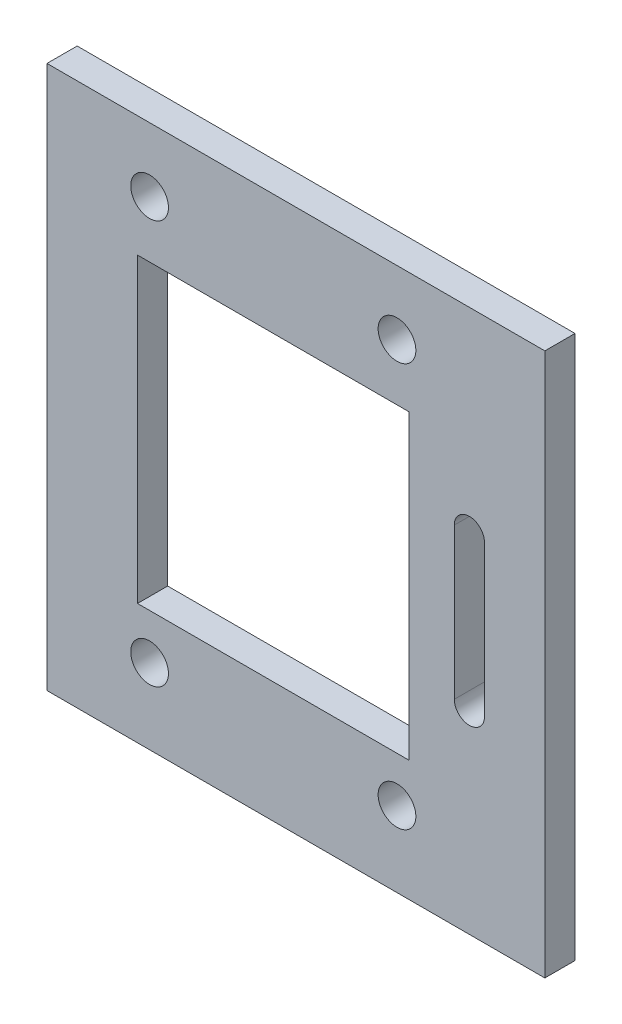
ISO-10303-21;
HEADER;
FILE_DESCRIPTION(('STEP AP214'),'2;1');
FILE_NAME('part.step','',(''),(''),'','','');
FILE_SCHEMA(('AUTOMOTIVE_DESIGN { 1 0 10303 214 1 1 1 1 }'));
ENDSEC;
DATA;
#1=APPLICATION_CONTEXT('core data for automotive mechanical design processes');
#2=APPLICATION_PROTOCOL_DEFINITION('international standard','automotive_design',2000,#1);
#3=PRODUCT_CONTEXT('',#1,'mechanical');
#4=PRODUCT('Part','Part','',(#3));
#5=PRODUCT_RELATED_PRODUCT_CATEGORY('part','',(#4));
#6=PRODUCT_DEFINITION_FORMATION('','',#4);
#7=PRODUCT_DEFINITION_CONTEXT('part definition',#1,'design');
#8=PRODUCT_DEFINITION('design','',#6,#7);
#9=PRODUCT_DEFINITION_SHAPE('','',#8);
#10=(LENGTH_UNIT() NAMED_UNIT(*) SI_UNIT(.MILLI.,.METRE.));
#11=(NAMED_UNIT(*) PLANE_ANGLE_UNIT() SI_UNIT($,.RADIAN.));
#12=(NAMED_UNIT(*) SI_UNIT($,.STERADIAN.) SOLID_ANGLE_UNIT());
#13=UNCERTAINTY_MEASURE_WITH_UNIT(LENGTH_MEASURE(1.E-05),#10,'distance_accuracy_value','');
#14=(GEOMETRIC_REPRESENTATION_CONTEXT(3) GLOBAL_UNCERTAINTY_ASSIGNED_CONTEXT((#13)) GLOBAL_UNIT_ASSIGNED_CONTEXT((#10,
#11,#12)) REPRESENTATION_CONTEXT('',''));
#15=CARTESIAN_POINT('',(0.,0.,0.));
#16=DIRECTION('',(0.,0.,1.));
#17=DIRECTION('',(1.,0.,0.));
#18=AXIS2_PLACEMENT_3D('',#15,#16,#17);
#19=CARTESIAN_POINT('',(0.,0.,4.));
#20=DIRECTION('',(0.,0.,-1.));
#21=DIRECTION('',(-1.,0.,0.));
#22=AXIS2_PLACEMENT_3D('',#19,#20,#21);
#23=PLANE('',#22);
#24=DIRECTION('',(0.,-1.,0.));
#25=VECTOR('',#24,1.);
#26=CARTESIAN_POINT('',(54.,46.,4.));
#27=LINE('',#26,#25);
#28=CARTESIAN_POINT('',(54.,46.,4.));
#29=VERTEX_POINT('',#28);
#30=CARTESIAN_POINT('',(54.,26.,4.));
#31=VERTEX_POINT('',#30);
#32=EDGE_CURVE('E133',#29,#31,#27,.T.);
#33=ORIENTED_EDGE('',*,*,#32,.F.);
#34=CARTESIAN_POINT('',(56.,46.,4.));
#35=DIRECTION('',(0.,0.,1.));
#36=DIRECTION('',(1.,0.,0.));
#37=AXIS2_PLACEMENT_3D('',#34,#35,#36);
#38=CIRCLE('',#37,2.00000000000001);
#39=CARTESIAN_POINT('',(58.,46.,4.));
#40=VERTEX_POINT('',#39);
#41=EDGE_CURVE('E48',#40,#29,#38,.T.);
#42=ORIENTED_EDGE('',*,*,#41,.F.);
#43=DIRECTION('',(0.,1.,0.));
#44=VECTOR('',#43,1.);
#45=CARTESIAN_POINT('',(58.,46.,4.));
#46=LINE('',#45,#44);
#47=CARTESIAN_POINT('',(58.,26.,4.));
#48=VERTEX_POINT('',#47);
#49=EDGE_CURVE('E139',#48,#40,#46,.T.);
#50=ORIENTED_EDGE('',*,*,#49,.F.);
#51=CARTESIAN_POINT('',(56.,26.,4.));
#52=DIRECTION('',(0.,0.,1.));
#53=DIRECTION('',(1.,0.,0.));
#54=AXIS2_PLACEMENT_3D('',#51,#52,#53);
#55=CIRCLE('',#54,2.00000000000001);
#56=EDGE_CURVE('E124',#31,#48,#55,.T.);
#57=ORIENTED_EDGE('',*,*,#56,.F.);
#58=EDGE_LOOP('',(#33,#42,#50,#57));
#59=FACE_BOUND('',#58,.T.);
#60=CARTESIAN_POINT('',(46.4,10.,4.));
#61=DIRECTION('',(0.,0.,1.));
#62=DIRECTION('',(1.,0.,0.));
#63=AXIS2_PLACEMENT_3D('',#60,#61,#62);
#64=CIRCLE('',#63,2.5);
#65=CARTESIAN_POINT('',(48.9,10.,4.));
#66=VERTEX_POINT('',#65);
#67=EDGE_CURVE('E146',#66,#66,#64,.T.);
#68=ORIENTED_EDGE('',*,*,#67,.F.);
#69=EDGE_LOOP('',(#68));
#70=FACE_BOUND('',#69,.T.);
#71=CARTESIAN_POINT('',(13.6,10.,4.));
#72=DIRECTION('',(0.,0.,1.));
#73=DIRECTION('',(1.,0.,0.));
#74=AXIS2_PLACEMENT_3D('',#71,#72,#73);
#75=CIRCLE('',#74,2.5);
#76=CARTESIAN_POINT('',(16.1,10.,4.));
#77=VERTEX_POINT('',#76);
#78=EDGE_CURVE('E153',#77,#77,#75,.T.);
#79=ORIENTED_EDGE('',*,*,#78,.F.);
#80=EDGE_LOOP('',(#79));
#81=FACE_BOUND('',#80,.T.);
#82=CARTESIAN_POINT('',(13.6,63.5,4.));
#83=DIRECTION('',(0.,0.,1.));
#84=DIRECTION('',(1.,0.,0.));
#85=AXIS2_PLACEMENT_3D('',#82,#83,#84);
#86=CIRCLE('',#85,2.5);
#87=CARTESIAN_POINT('',(16.1,63.5,4.));
#88=VERTEX_POINT('',#87);
#89=EDGE_CURVE('E149',#88,#88,#86,.T.);
#90=ORIENTED_EDGE('',*,*,#89,.F.);
#91=EDGE_LOOP('',(#90));
#92=FACE_BOUND('',#91,.T.);
#93=CARTESIAN_POINT('',(46.4,63.5,4.));
#94=DIRECTION('',(0.,0.,1.));
#95=DIRECTION('',(1.,0.,0.));
#96=AXIS2_PLACEMENT_3D('',#93,#94,#95);
#97=CIRCLE('',#96,2.5);
#98=CARTESIAN_POINT('',(48.9,63.5,4.));
#99=VERTEX_POINT('',#98);
#100=EDGE_CURVE('E152',#99,#99,#97,.T.);
#101=ORIENTED_EDGE('',*,*,#100,.F.);
#102=EDGE_LOOP('',(#101));
#103=FACE_BOUND('',#102,.T.);
#104=DIRECTION('',(0.,-1.,0.));
#105=VECTOR('',#104,1.);
#106=CARTESIAN_POINT('',(0.,0.,4.));
#107=LINE('',#106,#105);
#108=CARTESIAN_POINT('',(0.,72.,4.));
#109=VERTEX_POINT('',#108);
#110=CARTESIAN_POINT('',(0.,0.,4.));
#111=VERTEX_POINT('',#110);
#112=EDGE_CURVE('E194',#109,#111,#107,.T.);
#113=ORIENTED_EDGE('',*,*,#112,.T.);
#114=DIRECTION('',(1.,0.,0.));
#115=VECTOR('',#114,1.);
#116=CARTESIAN_POINT('',(0.,0.,4.));
#117=LINE('',#116,#115);
#118=CARTESIAN_POINT('',(66.,0.,4.));
#119=VERTEX_POINT('',#118);
#120=EDGE_CURVE('E197',#111,#119,#117,.T.);
#121=ORIENTED_EDGE('',*,*,#120,.T.);
#122=DIRECTION('',(0.,1.,0.));
#123=VECTOR('',#122,1.);
#124=CARTESIAN_POINT('',(66.,0.,4.));
#125=LINE('',#124,#123);
#126=CARTESIAN_POINT('',(66.,72.,4.));
#127=VERTEX_POINT('',#126);
#128=EDGE_CURVE('E200',#119,#127,#125,.T.);
#129=ORIENTED_EDGE('',*,*,#128,.T.);
#130=DIRECTION('',(-1.,0.,0.));
#131=VECTOR('',#130,1.);
#132=CARTESIAN_POINT('',(0.,72.,4.));
#133=LINE('',#132,#131);
#134=EDGE_CURVE('E202',#127,#109,#133,.T.);
#135=ORIENTED_EDGE('',*,*,#134,.T.);
#136=EDGE_LOOP('',(#113,#121,#129,#135));
#137=FACE_BOUND('',#136,.T.);
#138=DIRECTION('',(0.,-1.,0.));
#139=VECTOR('',#138,1.);
#140=CARTESIAN_POINT('',(12.,16.,4.));
#141=LINE('',#140,#139);
#142=CARTESIAN_POINT('',(12.,56.,4.));
#143=VERTEX_POINT('',#142);
#144=CARTESIAN_POINT('',(12.,16.,4.));
#145=VERTEX_POINT('',#144);
#146=EDGE_CURVE('E161',#143,#145,#141,.T.);
#147=ORIENTED_EDGE('',*,*,#146,.F.);
#148=DIRECTION('',(-1.,0.,0.));
#149=VECTOR('',#148,1.);
#150=CARTESIAN_POINT('',(12.,56.,4.));
#151=LINE('',#150,#149);
#152=CARTESIAN_POINT('',(48.,56.,4.));
#153=VERTEX_POINT('',#152);
#154=EDGE_CURVE('E169',#153,#143,#151,.T.);
#155=ORIENTED_EDGE('',*,*,#154,.F.);
#156=DIRECTION('',(0.,1.,0.));
#157=VECTOR('',#156,1.);
#158=CARTESIAN_POINT('',(48.,16.,4.));
#159=LINE('',#158,#157);
#160=CARTESIAN_POINT('',(48.,16.,4.));
#161=VERTEX_POINT('',#160);
#162=EDGE_CURVE('E166',#161,#153,#159,.T.);
#163=ORIENTED_EDGE('',*,*,#162,.F.);
#164=DIRECTION('',(1.,0.,0.));
#165=VECTOR('',#164,1.);
#166=CARTESIAN_POINT('',(12.,16.,4.));
#167=LINE('',#166,#165);
#168=EDGE_CURVE('E163',#145,#161,#167,.T.);
#169=ORIENTED_EDGE('',*,*,#168,.F.);
#170=EDGE_LOOP('',(#147,#155,#163,#169));
#171=FACE_BOUND('',#170,.T.);
#172=ADVANCED_FACE('F33',(#59,#70,#81,#92,#103,#137,#171),#23,.F.);
#173=CARTESIAN_POINT('',(0.,0.,0.));
#174=DIRECTION('',(0.,0.,-1.));
#175=DIRECTION('',(-1.,0.,0.));
#176=AXIS2_PLACEMENT_3D('',#173,#174,#175);
#177=PLANE('',#176);
#178=CARTESIAN_POINT('',(56.,46.,0.));
#179=DIRECTION('',(0.,0.,-1.));
#180=DIRECTION('',(-1.,0.,0.));
#181=AXIS2_PLACEMENT_3D('',#178,#179,#180);
#182=CIRCLE('',#181,2.00000000000001);
#183=CARTESIAN_POINT('',(54.,46.,0.));
#184=VERTEX_POINT('',#183);
#185=CARTESIAN_POINT('',(58.,46.,0.));
#186=VERTEX_POINT('',#185);
#187=EDGE_CURVE('E11',#184,#186,#182,.T.);
#188=ORIENTED_EDGE('',*,*,#187,.F.);
#189=DIRECTION('',(0.,1.,0.));
#190=VECTOR('',#189,1.);
#191=CARTESIAN_POINT('',(54.,0.,0.));
#192=LINE('',#191,#190);
#193=CARTESIAN_POINT('',(54.,26.,0.));
#194=VERTEX_POINT('',#193);
#195=EDGE_CURVE('E223',#194,#184,#192,.T.);
#196=ORIENTED_EDGE('',*,*,#195,.F.);
#197=CARTESIAN_POINT('',(56.,26.,0.));
#198=DIRECTION('',(0.,0.,-1.));
#199=DIRECTION('',(-1.,0.,0.));
#200=AXIS2_PLACEMENT_3D('',#197,#198,#199);
#201=CIRCLE('',#200,2.00000000000001);
#202=CARTESIAN_POINT('',(58.,26.,0.));
#203=VERTEX_POINT('',#202);
#204=EDGE_CURVE('E127',#203,#194,#201,.T.);
#205=ORIENTED_EDGE('',*,*,#204,.F.);
#206=DIRECTION('',(0.,-1.,0.));
#207=VECTOR('',#206,1.);
#208=CARTESIAN_POINT('',(58.,0.,0.));
#209=LINE('',#208,#207);
#210=EDGE_CURVE('E41',#186,#203,#209,.T.);
#211=ORIENTED_EDGE('',*,*,#210,.F.);
#212=EDGE_LOOP('',(#188,#196,#205,#211));
#213=FACE_BOUND('',#212,.T.);
#214=CARTESIAN_POINT('',(46.4,10.,0.));
#215=DIRECTION('',(0.,0.,-1.));
#216=DIRECTION('',(-1.,0.,0.));
#217=AXIS2_PLACEMENT_3D('',#214,#215,#216);
#218=CIRCLE('',#217,2.5);
#219=CARTESIAN_POINT('',(43.9,10.,0.));
#220=VERTEX_POINT('',#219);
#221=EDGE_CURVE('E176',#220,#220,#218,.T.);
#222=ORIENTED_EDGE('',*,*,#221,.F.);
#223=EDGE_LOOP('',(#222));
#224=FACE_BOUND('',#223,.T.);
#225=CARTESIAN_POINT('',(13.6,10.,0.));
#226=DIRECTION('',(0.,0.,-1.));
#227=DIRECTION('',(-1.,0.,0.));
#228=AXIS2_PLACEMENT_3D('',#225,#226,#227);
#229=CIRCLE('',#228,2.5);
#230=CARTESIAN_POINT('',(11.1,10.,0.));
#231=VERTEX_POINT('',#230);
#232=EDGE_CURVE('E229',#231,#231,#229,.T.);
#233=ORIENTED_EDGE('',*,*,#232,.F.);
#234=EDGE_LOOP('',(#233));
#235=FACE_BOUND('',#234,.T.);
#236=CARTESIAN_POINT('',(13.6,63.5,0.));
#237=DIRECTION('',(0.,0.,-1.));
#238=DIRECTION('',(-1.,0.,0.));
#239=AXIS2_PLACEMENT_3D('',#236,#237,#238);
#240=CIRCLE('',#239,2.5);
#241=CARTESIAN_POINT('',(11.1,63.5,0.));
#242=VERTEX_POINT('',#241);
#243=EDGE_CURVE('E226',#242,#242,#240,.T.);
#244=ORIENTED_EDGE('',*,*,#243,.F.);
#245=EDGE_LOOP('',(#244));
#246=FACE_BOUND('',#245,.T.);
#247=CARTESIAN_POINT('',(46.4,63.5,0.));
#248=DIRECTION('',(0.,0.,-1.));
#249=DIRECTION('',(-1.,0.,0.));
#250=AXIS2_PLACEMENT_3D('',#247,#248,#249);
#251=CIRCLE('',#250,2.5);
#252=CARTESIAN_POINT('',(43.9,63.5,0.));
#253=VERTEX_POINT('',#252);
#254=EDGE_CURVE('E160',#253,#253,#251,.T.);
#255=ORIENTED_EDGE('',*,*,#254,.F.);
#256=EDGE_LOOP('',(#255));
#257=FACE_BOUND('',#256,.T.);
#258=DIRECTION('',(0.,-1.,0.));
#259=VECTOR('',#258,1.);
#260=CARTESIAN_POINT('',(0.,0.,0.));
#261=LINE('',#260,#259);
#262=CARTESIAN_POINT('',(0.,72.,0.));
#263=VERTEX_POINT('',#262);
#264=CARTESIAN_POINT('',(0.,0.,0.));
#265=VERTEX_POINT('',#264);
#266=EDGE_CURVE('E193',#263,#265,#261,.T.);
#267=ORIENTED_EDGE('',*,*,#266,.F.);
#268=DIRECTION('',(-1.,0.,0.));
#269=VECTOR('',#268,1.);
#270=CARTESIAN_POINT('',(0.,72.,0.));
#271=LINE('',#270,#269);
#272=CARTESIAN_POINT('',(66.,72.,0.));
#273=VERTEX_POINT('',#272);
#274=EDGE_CURVE('E198',#273,#263,#271,.T.);
#275=ORIENTED_EDGE('',*,*,#274,.F.);
#276=DIRECTION('',(0.,1.,0.));
#277=VECTOR('',#276,1.);
#278=CARTESIAN_POINT('',(66.,0.,0.));
#279=LINE('',#278,#277);
#280=CARTESIAN_POINT('',(66.,0.,0.));
#281=VERTEX_POINT('',#280);
#282=EDGE_CURVE('E209',#281,#273,#279,.T.);
#283=ORIENTED_EDGE('',*,*,#282,.F.);
#284=DIRECTION('',(1.,0.,0.));
#285=VECTOR('',#284,1.);
#286=CARTESIAN_POINT('',(0.,0.,0.));
#287=LINE('',#286,#285);
#288=EDGE_CURVE('E207',#265,#281,#287,.T.);
#289=ORIENTED_EDGE('',*,*,#288,.F.);
#290=EDGE_LOOP('',(#267,#275,#283,#289));
#291=FACE_BOUND('',#290,.T.);
#292=DIRECTION('',(-1.,0.,0.));
#293=VECTOR('',#292,1.);
#294=CARTESIAN_POINT('',(12.,56.,0.));
#295=LINE('',#294,#293);
#296=CARTESIAN_POINT('',(48.,56.,0.));
#297=VERTEX_POINT('',#296);
#298=CARTESIAN_POINT('',(12.,56.,0.));
#299=VERTEX_POINT('',#298);
#300=EDGE_CURVE('E164',#297,#299,#295,.T.);
#301=ORIENTED_EDGE('',*,*,#300,.T.);
#302=DIRECTION('',(0.,-1.,0.));
#303=VECTOR('',#302,1.);
#304=CARTESIAN_POINT('',(12.,16.,0.));
#305=LINE('',#304,#303);
#306=CARTESIAN_POINT('',(12.,16.,0.));
#307=VERTEX_POINT('',#306);
#308=EDGE_CURVE('E172',#299,#307,#305,.T.);
#309=ORIENTED_EDGE('',*,*,#308,.T.);
#310=DIRECTION('',(1.,0.,0.));
#311=VECTOR('',#310,1.);
#312=CARTESIAN_POINT('',(12.,16.,0.));
#313=LINE('',#312,#311);
#314=CARTESIAN_POINT('',(48.,16.,0.));
#315=VERTEX_POINT('',#314);
#316=EDGE_CURVE('E175',#307,#315,#313,.T.);
#317=ORIENTED_EDGE('',*,*,#316,.T.);
#318=DIRECTION('',(0.,1.,0.));
#319=VECTOR('',#318,1.);
#320=CARTESIAN_POINT('',(48.,16.,0.));
#321=LINE('',#320,#319);
#322=EDGE_CURVE('E179',#315,#297,#321,.T.);
#323=ORIENTED_EDGE('',*,*,#322,.T.);
#324=EDGE_LOOP('',(#301,#309,#317,#323));
#325=FACE_BOUND('',#324,.T.);
#326=ADVANCED_FACE('F241',(#213,#224,#235,#246,#257,#291,#325),#177,.T.);
#327=CARTESIAN_POINT('',(0.,0.,4.));
#328=DIRECTION('',(1.,0.,0.));
#329=DIRECTION('',(0.,0.,-1.));
#330=AXIS2_PLACEMENT_3D('',#327,#328,#329);
#331=PLANE('',#330);
#332=ORIENTED_EDGE('',*,*,#266,.T.);
#333=DIRECTION('',(0.,0.,-1.));
#334=VECTOR('',#333,1.);
#335=CARTESIAN_POINT('',(0.,0.,4.));
#336=LINE('',#335,#334);
#337=EDGE_CURVE('E220',#111,#265,#336,.T.);
#338=ORIENTED_EDGE('',*,*,#337,.F.);
#339=ORIENTED_EDGE('',*,*,#112,.F.);
#340=DIRECTION('',(0.,0.,-1.));
#341=VECTOR('',#340,1.);
#342=CARTESIAN_POINT('',(0.,72.,4.));
#343=LINE('',#342,#341);
#344=EDGE_CURVE('E204',#109,#263,#343,.T.);
#345=ORIENTED_EDGE('',*,*,#344,.T.);
#346=EDGE_LOOP('',(#332,#338,#339,#345));
#347=FACE_BOUND('',#346,.T.);
#348=ADVANCED_FACE('F35',(#347),#331,.F.);
#349=CARTESIAN_POINT('',(0.,0.,4.));
#350=DIRECTION('',(0.,1.,0.));
#351=DIRECTION('',(0.,0.,1.));
#352=AXIS2_PLACEMENT_3D('',#349,#350,#351);
#353=PLANE('',#352);
#354=ORIENTED_EDGE('',*,*,#288,.T.);
#355=DIRECTION('',(0.,0.,-1.));
#356=VECTOR('',#355,1.);
#357=CARTESIAN_POINT('',(66.,0.,4.));
#358=LINE('',#357,#356);
#359=EDGE_CURVE('E217',#119,#281,#358,.T.);
#360=ORIENTED_EDGE('',*,*,#359,.F.);
#361=ORIENTED_EDGE('',*,*,#120,.F.);
#362=ORIENTED_EDGE('',*,*,#337,.T.);
#363=EDGE_LOOP('',(#354,#360,#361,#362));
#364=FACE_BOUND('',#363,.T.);
#365=ADVANCED_FACE('F273',(#364),#353,.F.);
#366=CARTESIAN_POINT('',(66.,0.,4.));
#367=DIRECTION('',(-1.,0.,0.));
#368=DIRECTION('',(0.,0.,1.));
#369=AXIS2_PLACEMENT_3D('',#366,#367,#368);
#370=PLANE('',#369);
#371=ORIENTED_EDGE('',*,*,#282,.T.);
#372=DIRECTION('',(0.,0.,-1.));
#373=VECTOR('',#372,1.);
#374=CARTESIAN_POINT('',(66.,72.,4.));
#375=LINE('',#374,#373);
#376=EDGE_CURVE('E214',#127,#273,#375,.T.);
#377=ORIENTED_EDGE('',*,*,#376,.F.);
#378=ORIENTED_EDGE('',*,*,#128,.F.);
#379=ORIENTED_EDGE('',*,*,#359,.T.);
#380=EDGE_LOOP('',(#371,#377,#378,#379));
#381=FACE_BOUND('',#380,.T.);
#382=ADVANCED_FACE('F270',(#381),#370,.F.);
#383=CARTESIAN_POINT('',(0.,72.,4.));
#384=DIRECTION('',(0.,-1.,0.));
#385=DIRECTION('',(0.,0.,-1.));
#386=AXIS2_PLACEMENT_3D('',#383,#384,#385);
#387=PLANE('',#386);
#388=ORIENTED_EDGE('',*,*,#274,.T.);
#389=ORIENTED_EDGE('',*,*,#344,.F.);
#390=ORIENTED_EDGE('',*,*,#134,.F.);
#391=ORIENTED_EDGE('',*,*,#376,.T.);
#392=EDGE_LOOP('',(#388,#389,#390,#391));
#393=FACE_BOUND('',#392,.T.);
#394=ADVANCED_FACE('F267',(#393),#387,.F.);
#395=CARTESIAN_POINT('',(12.,16.,4.));
#396=DIRECTION('',(1.,0.,0.));
#397=DIRECTION('',(0.,0.,-1.));
#398=AXIS2_PLACEMENT_3D('',#395,#396,#397);
#399=PLANE('',#398);
#400=ORIENTED_EDGE('',*,*,#308,.F.);
#401=DIRECTION('',(0.,0.,-1.));
#402=VECTOR('',#401,1.);
#403=CARTESIAN_POINT('',(12.,56.,4.));
#404=LINE('',#403,#402);
#405=EDGE_CURVE('E171',#143,#299,#404,.T.);
#406=ORIENTED_EDGE('',*,*,#405,.F.);
#407=ORIENTED_EDGE('',*,*,#146,.T.);
#408=DIRECTION('',(0.,0.,-1.));
#409=VECTOR('',#408,1.);
#410=CARTESIAN_POINT('',(12.,16.,4.));
#411=LINE('',#410,#409);
#412=EDGE_CURVE('E190',#145,#307,#411,.T.);
#413=ORIENTED_EDGE('',*,*,#412,.T.);
#414=EDGE_LOOP('',(#400,#406,#407,#413));
#415=FACE_BOUND('',#414,.T.);
#416=ADVANCED_FACE('F264',(#415),#399,.T.);
#417=CARTESIAN_POINT('',(12.,16.,4.));
#418=DIRECTION('',(0.,1.,0.));
#419=DIRECTION('',(0.,0.,1.));
#420=AXIS2_PLACEMENT_3D('',#417,#418,#419);
#421=PLANE('',#420);
#422=ORIENTED_EDGE('',*,*,#316,.F.);
#423=ORIENTED_EDGE('',*,*,#412,.F.);
#424=ORIENTED_EDGE('',*,*,#168,.T.);
#425=DIRECTION('',(0.,0.,-1.));
#426=VECTOR('',#425,1.);
#427=CARTESIAN_POINT('',(48.,16.,4.));
#428=LINE('',#427,#426);
#429=EDGE_CURVE('E188',#161,#315,#428,.T.);
#430=ORIENTED_EDGE('',*,*,#429,.T.);
#431=EDGE_LOOP('',(#422,#423,#424,#430));
#432=FACE_BOUND('',#431,.T.);
#433=ADVANCED_FACE('F303',(#432),#421,.T.);
#434=CARTESIAN_POINT('',(48.,16.,4.));
#435=DIRECTION('',(-1.,0.,0.));
#436=DIRECTION('',(0.,0.,1.));
#437=AXIS2_PLACEMENT_3D('',#434,#435,#436);
#438=PLANE('',#437);
#439=ORIENTED_EDGE('',*,*,#322,.F.);
#440=ORIENTED_EDGE('',*,*,#429,.F.);
#441=ORIENTED_EDGE('',*,*,#162,.T.);
#442=DIRECTION('',(0.,0.,-1.));
#443=VECTOR('',#442,1.);
#444=CARTESIAN_POINT('',(48.,56.,4.));
#445=LINE('',#444,#443);
#446=EDGE_CURVE('E186',#153,#297,#445,.T.);
#447=ORIENTED_EDGE('',*,*,#446,.T.);
#448=EDGE_LOOP('',(#439,#440,#441,#447));
#449=FACE_BOUND('',#448,.T.);
#450=ADVANCED_FACE('F310',(#449),#438,.T.);
#451=CARTESIAN_POINT('',(12.,56.,4.));
#452=DIRECTION('',(0.,-1.,0.));
#453=DIRECTION('',(0.,0.,-1.));
#454=AXIS2_PLACEMENT_3D('',#451,#452,#453);
#455=PLANE('',#454);
#456=ORIENTED_EDGE('',*,*,#300,.F.);
#457=ORIENTED_EDGE('',*,*,#446,.F.);
#458=ORIENTED_EDGE('',*,*,#154,.T.);
#459=ORIENTED_EDGE('',*,*,#405,.T.);
#460=EDGE_LOOP('',(#456,#457,#458,#459));
#461=FACE_BOUND('',#460,.T.);
#462=ADVANCED_FACE('F308',(#461),#455,.T.);
#463=CARTESIAN_POINT('',(46.4,63.5,-6.));
#464=DIRECTION('',(0.,0.,1.));
#465=DIRECTION('',(1.,0.,0.));
#466=AXIS2_PLACEMENT_3D('',#463,#464,#465);
#467=CYLINDRICAL_SURFACE('',#466,2.5);
#468=ORIENTED_EDGE('',*,*,#254,.T.);
#469=EDGE_LOOP('',(#468));
#470=FACE_BOUND('',#469,.T.);
#471=ORIENTED_EDGE('',*,*,#100,.T.);
#472=EDGE_LOOP('',(#471));
#473=FACE_BOUND('',#472,.T.);
#474=ADVANCED_FACE('F317',(#470,#473),#467,.F.);
#475=CARTESIAN_POINT('',(13.6,63.5,-6.));
#476=DIRECTION('',(0.,0.,1.));
#477=DIRECTION('',(1.,0.,0.));
#478=AXIS2_PLACEMENT_3D('',#475,#476,#477);
#479=CYLINDRICAL_SURFACE('',#478,2.5);
#480=ORIENTED_EDGE('',*,*,#243,.T.);
#481=EDGE_LOOP('',(#480));
#482=FACE_BOUND('',#481,.T.);
#483=ORIENTED_EDGE('',*,*,#89,.T.);
#484=EDGE_LOOP('',(#483));
#485=FACE_BOUND('',#484,.T.);
#486=ADVANCED_FACE('F321',(#482,#485),#479,.F.);
#487=CARTESIAN_POINT('',(13.6,10.,-6.));
#488=DIRECTION('',(0.,0.,1.));
#489=DIRECTION('',(1.,0.,0.));
#490=AXIS2_PLACEMENT_3D('',#487,#488,#489);
#491=CYLINDRICAL_SURFACE('',#490,2.5);
#492=ORIENTED_EDGE('',*,*,#232,.T.);
#493=EDGE_LOOP('',(#492));
#494=FACE_BOUND('',#493,.T.);
#495=ORIENTED_EDGE('',*,*,#78,.T.);
#496=EDGE_LOOP('',(#495));
#497=FACE_BOUND('',#496,.T.);
#498=ADVANCED_FACE('F252',(#494,#497),#491,.F.);
#499=CARTESIAN_POINT('',(46.4,10.,-6.));
#500=DIRECTION('',(0.,0.,1.));
#501=DIRECTION('',(1.,0.,0.));
#502=AXIS2_PLACEMENT_3D('',#499,#500,#501);
#503=CYLINDRICAL_SURFACE('',#502,2.5);
#504=ORIENTED_EDGE('',*,*,#221,.T.);
#505=EDGE_LOOP('',(#504));
#506=FACE_BOUND('',#505,.T.);
#507=ORIENTED_EDGE('',*,*,#67,.T.);
#508=EDGE_LOOP('',(#507));
#509=FACE_BOUND('',#508,.T.);
#510=ADVANCED_FACE('F245',(#506,#509),#503,.F.);
#511=CARTESIAN_POINT('',(56.,46.,-6.));
#512=DIRECTION('',(0.,0.,1.));
#513=DIRECTION('',(1.,0.,0.));
#514=AXIS2_PLACEMENT_3D('',#511,#512,#513);
#515=CYLINDRICAL_SURFACE('',#514,2.00000000000001);
#516=ORIENTED_EDGE('',*,*,#187,.T.);
#517=DIRECTION('',(0.,0.,1.));
#518=VECTOR('',#517,1.);
#519=CARTESIAN_POINT('',(58.,46.,-6.));
#520=LINE('',#519,#518);
#521=EDGE_CURVE('E144',#186,#40,#520,.T.);
#522=ORIENTED_EDGE('',*,*,#521,.T.);
#523=ORIENTED_EDGE('',*,*,#41,.T.);
#524=DIRECTION('',(0.,0.,1.));
#525=VECTOR('',#524,1.);
#526=CARTESIAN_POINT('',(54.,46.,-6.));
#527=LINE('',#526,#525);
#528=EDGE_CURVE('E130',#184,#29,#527,.T.);
#529=ORIENTED_EDGE('',*,*,#528,.F.);
#530=EDGE_LOOP('',(#516,#522,#523,#529));
#531=FACE_BOUND('',#530,.T.);
#532=ADVANCED_FACE('F243',(#531),#515,.F.);
#533=CARTESIAN_POINT('',(58.,46.,-6.));
#534=DIRECTION('',(1.,0.,0.));
#535=DIRECTION('',(0.,1.,0.));
#536=AXIS2_PLACEMENT_3D('',#533,#534,#535);
#537=PLANE('',#536);
#538=ORIENTED_EDGE('',*,*,#210,.T.);
#539=DIRECTION('',(0.,0.,1.));
#540=VECTOR('',#539,1.);
#541=CARTESIAN_POINT('',(58.,26.,-6.));
#542=LINE('',#541,#540);
#543=EDGE_CURVE('E129',#203,#48,#542,.T.);
#544=ORIENTED_EDGE('',*,*,#543,.T.);
#545=ORIENTED_EDGE('',*,*,#49,.T.);
#546=ORIENTED_EDGE('',*,*,#521,.F.);
#547=EDGE_LOOP('',(#538,#544,#545,#546));
#548=FACE_BOUND('',#547,.T.);
#549=ADVANCED_FACE('F238',(#548),#537,.F.);
#550=CARTESIAN_POINT('',(56.,26.,-6.));
#551=DIRECTION('',(0.,0.,1.));
#552=DIRECTION('',(1.,0.,0.));
#553=AXIS2_PLACEMENT_3D('',#550,#551,#552);
#554=CYLINDRICAL_SURFACE('',#553,2.00000000000001);
#555=ORIENTED_EDGE('',*,*,#204,.T.);
#556=DIRECTION('',(0.,0.,1.));
#557=VECTOR('',#556,1.);
#558=CARTESIAN_POINT('',(54.,26.,-6.));
#559=LINE('',#558,#557);
#560=EDGE_CURVE('E56',#194,#31,#559,.T.);
#561=ORIENTED_EDGE('',*,*,#560,.T.);
#562=ORIENTED_EDGE('',*,*,#56,.T.);
#563=ORIENTED_EDGE('',*,*,#543,.F.);
#564=EDGE_LOOP('',(#555,#561,#562,#563));
#565=FACE_BOUND('',#564,.T.);
#566=ADVANCED_FACE('F121',(#565),#554,.F.);
#567=CARTESIAN_POINT('',(54.,46.,-6.));
#568=DIRECTION('',(-1.,0.,0.));
#569=DIRECTION('',(0.,-1.,0.));
#570=AXIS2_PLACEMENT_3D('',#567,#568,#569);
#571=PLANE('',#570);
#572=ORIENTED_EDGE('',*,*,#195,.T.);
#573=ORIENTED_EDGE('',*,*,#528,.T.);
#574=ORIENTED_EDGE('',*,*,#32,.T.);
#575=ORIENTED_EDGE('',*,*,#560,.F.);
#576=EDGE_LOOP('',(#572,#573,#574,#575));
#577=FACE_BOUND('',#576,.T.);
#578=ADVANCED_FACE('F134',(#577),#571,.F.);
#579=CLOSED_SHELL('',(#172,#326,#348,#365,#382,#394,#416,#433,#450,#462,#474,#486,#498,#510,
#532,#549,#566,#578));
#580=MANIFOLD_SOLID_BREP('B2',#579);
#581=ADVANCED_BREP_SHAPE_REPRESENTATION('',(#18,#580),#14);
#582=SHAPE_DEFINITION_REPRESENTATION(#9,#581);
ENDSEC;
END-ISO-10303-21;
